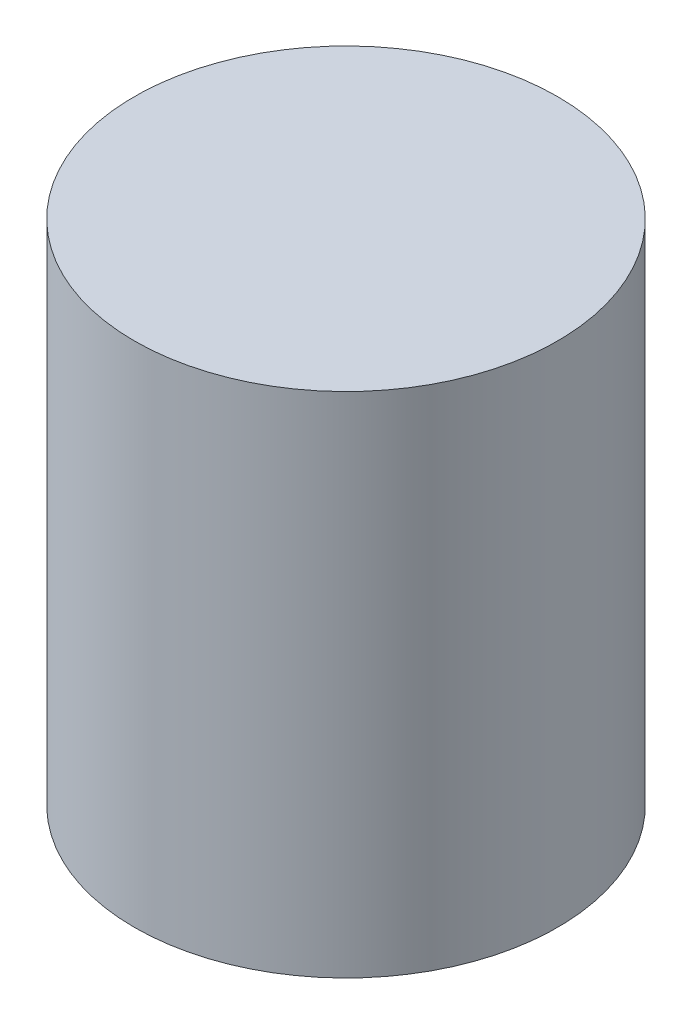
ISO-10303-21;
HEADER;
FILE_DESCRIPTION(('STEP AP214'),'2;1');
FILE_NAME('part.step','',(''),(''),'','','');
FILE_SCHEMA(('AUTOMOTIVE_DESIGN { 1 0 10303 214 1 1 1 1 }'));
ENDSEC;
DATA;
#1=APPLICATION_CONTEXT('core data for automotive mechanical design processes');
#2=APPLICATION_PROTOCOL_DEFINITION('international standard','automotive_design',2000,#1);
#3=PRODUCT_CONTEXT('',#1,'mechanical');
#4=PRODUCT('Part','Part','',(#3));
#5=PRODUCT_RELATED_PRODUCT_CATEGORY('part','',(#4));
#6=PRODUCT_DEFINITION_FORMATION('','',#4);
#7=PRODUCT_DEFINITION_CONTEXT('part definition',#1,'design');
#8=PRODUCT_DEFINITION('design','',#6,#7);
#9=PRODUCT_DEFINITION_SHAPE('','',#8);
#10=(LENGTH_UNIT() NAMED_UNIT(*) SI_UNIT(.MILLI.,.METRE.));
#11=(NAMED_UNIT(*) PLANE_ANGLE_UNIT() SI_UNIT($,.RADIAN.));
#12=(NAMED_UNIT(*) SI_UNIT($,.STERADIAN.) SOLID_ANGLE_UNIT());
#13=UNCERTAINTY_MEASURE_WITH_UNIT(LENGTH_MEASURE(1.E-05),#10,'distance_accuracy_value','');
#14=(GEOMETRIC_REPRESENTATION_CONTEXT(3) GLOBAL_UNCERTAINTY_ASSIGNED_CONTEXT((#13)) GLOBAL_UNIT_ASSIGNED_CONTEXT((#10,
#11,#12)) REPRESENTATION_CONTEXT('',''));
#15=CARTESIAN_POINT('',(0.,0.,0.));
#16=DIRECTION('',(0.,0.,1.));
#17=DIRECTION('',(1.,0.,0.));
#18=AXIS2_PLACEMENT_3D('',#15,#16,#17);
#19=CARTESIAN_POINT('',(0.,60.,0.));
#20=DIRECTION('',(0.,-1.,0.));
#21=DIRECTION('',(0.,0.,-1.));
#22=AXIS2_PLACEMENT_3D('',#19,#20,#21);
#23=CYLINDRICAL_SURFACE('',#22,25.);
#24=CARTESIAN_POINT('',(0.,60.,0.));
#25=DIRECTION('',(0.,1.,0.));
#26=DIRECTION('',(0.,0.,1.));
#27=AXIS2_PLACEMENT_3D('',#24,#25,#26);
#28=CIRCLE('',#27,25.);
#29=CARTESIAN_POINT('',(0.,60.,25.));
#30=VERTEX_POINT('',#29);
#31=EDGE_CURVE('E48',#30,#30,#28,.T.);
#32=ORIENTED_EDGE('',*,*,#31,.F.);
#33=EDGE_LOOP('',(#32));
#34=FACE_BOUND('',#33,.T.);
#35=CARTESIAN_POINT('',(0.,0.,0.));
#36=DIRECTION('',(0.,1.,0.));
#37=DIRECTION('',(0.,0.,1.));
#38=AXIS2_PLACEMENT_3D('',#35,#36,#37);
#39=CIRCLE('',#38,25.);
#40=CARTESIAN_POINT('',(0.,0.,25.));
#41=VERTEX_POINT('',#40);
#42=EDGE_CURVE('E53',#41,#41,#39,.T.);
#43=ORIENTED_EDGE('',*,*,#42,.T.);
#44=EDGE_LOOP('',(#43));
#45=FACE_BOUND('',#44,.T.);
#46=ADVANCED_FACE('F41',(#34,#45),#23,.T.);
#47=CARTESIAN_POINT('',(0.,60.,0.));
#48=DIRECTION('',(0.,1.,0.));
#49=DIRECTION('',(0.,0.,1.));
#50=AXIS2_PLACEMENT_3D('',#47,#48,#49);
#51=PLANE('',#50);
#52=ORIENTED_EDGE('',*,*,#31,.T.);
#53=EDGE_LOOP('',(#52));
#54=FACE_BOUND('',#53,.T.);
#55=ADVANCED_FACE('F84',(#54),#51,.T.);
#56=CARTESIAN_POINT('',(0.,0.,0.));
#57=DIRECTION('',(0.,1.,0.));
#58=DIRECTION('',(0.,0.,1.));
#59=AXIS2_PLACEMENT_3D('',#56,#57,#58);
#60=PLANE('',#59);
#61=ORIENTED_EDGE('',*,*,#42,.F.);
#62=EDGE_LOOP('',(#61));
#63=FACE_BOUND('',#62,.T.);
#64=CARTESIAN_POINT('',(0.,0.,0.));
#65=DIRECTION('',(0.,-1.,0.));
#66=DIRECTION('',(0.,0.,-1.));
#67=AXIS2_PLACEMENT_3D('',#64,#65,#66);
#68=CIRCLE('',#67,10.);
#69=CARTESIAN_POINT('',(0.,0.,-10.));
#70=VERTEX_POINT('',#69);
#71=EDGE_CURVE('E65',#70,#70,#68,.T.);
#72=ORIENTED_EDGE('',*,*,#71,.F.);
#73=EDGE_LOOP('',(#72));
#74=FACE_BOUND('',#73,.T.);
#75=ADVANCED_FACE('F82',(#63,#74),#60,.F.);
#76=CARTESIAN_POINT('',(0.,4.,0.));
#77=DIRECTION('',(0.,-1.,0.));
#78=DIRECTION('',(0.,0.,-1.));
#79=AXIS2_PLACEMENT_3D('',#76,#77,#78);
#80=PLANE('',#79);
#81=CARTESIAN_POINT('',(0.,4.,0.));
#82=DIRECTION('',(0.,-1.,0.));
#83=DIRECTION('',(0.,0.,-1.));
#84=AXIS2_PLACEMENT_3D('',#81,#82,#83);
#85=CIRCLE('',#84,10.);
#86=CARTESIAN_POINT('',(0.,4.,-10.));
#87=VERTEX_POINT('',#86);
#88=EDGE_CURVE('E64',#87,#87,#85,.T.);
#89=ORIENTED_EDGE('',*,*,#88,.T.);
#90=EDGE_LOOP('',(#89));
#91=FACE_BOUND('',#90,.T.);
#92=CARTESIAN_POINT('',(0.,4.,0.));
#93=DIRECTION('',(0.,-1.,0.));
#94=DIRECTION('',(0.,0.,-1.));
#95=AXIS2_PLACEMENT_3D('',#92,#93,#94);
#96=CIRCLE('',#95,22.);
#97=CARTESIAN_POINT('',(0.,4.,-22.));
#98=VERTEX_POINT('',#97);
#99=EDGE_CURVE('E10',#98,#98,#96,.F.);
#100=ORIENTED_EDGE('',*,*,#99,.T.);
#101=EDGE_LOOP('',(#100));
#102=FACE_BOUND('',#101,.T.);
#103=ADVANCED_FACE('F73',(#91,#102),#80,.F.);
#104=CARTESIAN_POINT('',(0.,4.,0.));
#105=DIRECTION('',(0.,-1.,0.));
#106=DIRECTION('',(0.,0.,-1.));
#107=AXIS2_PLACEMENT_3D('',#104,#105,#106);
#108=CYLINDRICAL_SURFACE('',#107,10.);
#109=ORIENTED_EDGE('',*,*,#88,.F.);
#110=EDGE_LOOP('',(#109));
#111=FACE_BOUND('',#110,.T.);
#112=ORIENTED_EDGE('',*,*,#71,.T.);
#113=EDGE_LOOP('',(#112));
#114=FACE_BOUND('',#113,.T.);
#115=ADVANCED_FACE('F75',(#111,#114),#108,.F.);
#116=CARTESIAN_POINT('',(0.,56.,0.));
#117=DIRECTION('',(0.,-1.,0.));
#118=DIRECTION('',(0.,0.,-1.));
#119=AXIS2_PLACEMENT_3D('',#116,#117,#118);
#120=PLANE('',#119);
#121=CARTESIAN_POINT('',(0.,56.,0.));
#122=DIRECTION('',(0.,-1.,0.));
#123=DIRECTION('',(0.,0.,-1.));
#124=AXIS2_PLACEMENT_3D('',#121,#122,#123);
#125=CIRCLE('',#124,22.);
#126=CARTESIAN_POINT('',(0.,56.,-22.));
#127=VERTEX_POINT('',#126);
#128=EDGE_CURVE('E59',#127,#127,#125,.T.);
#129=ORIENTED_EDGE('',*,*,#128,.T.);
#130=EDGE_LOOP('',(#129));
#131=FACE_BOUND('',#130,.T.);
#132=ADVANCED_FACE('F78',(#131),#120,.T.);
#133=CARTESIAN_POINT('',(0.,56.,0.));
#134=DIRECTION('',(0.,-1.,0.));
#135=DIRECTION('',(0.,0.,-1.));
#136=AXIS2_PLACEMENT_3D('',#133,#134,#135);
#137=CYLINDRICAL_SURFACE('',#136,22.);
#138=ORIENTED_EDGE('',*,*,#128,.F.);
#139=EDGE_LOOP('',(#138));
#140=FACE_BOUND('',#139,.T.);
#141=ORIENTED_EDGE('',*,*,#99,.F.);
#142=EDGE_LOOP('',(#141));
#143=FACE_BOUND('',#142,.T.);
#144=ADVANCED_FACE('F112',(#140,#143),#137,.F.);
#145=CLOSED_SHELL('',(#46,#55,#75,#103,#115,#132,#144));
#146=MANIFOLD_SOLID_BREP('B2',#145);
#147=ADVANCED_BREP_SHAPE_REPRESENTATION('',(#18,#146),#14);
#148=SHAPE_DEFINITION_REPRESENTATION(#9,#147);
ENDSEC;
END-ISO-10303-21;
